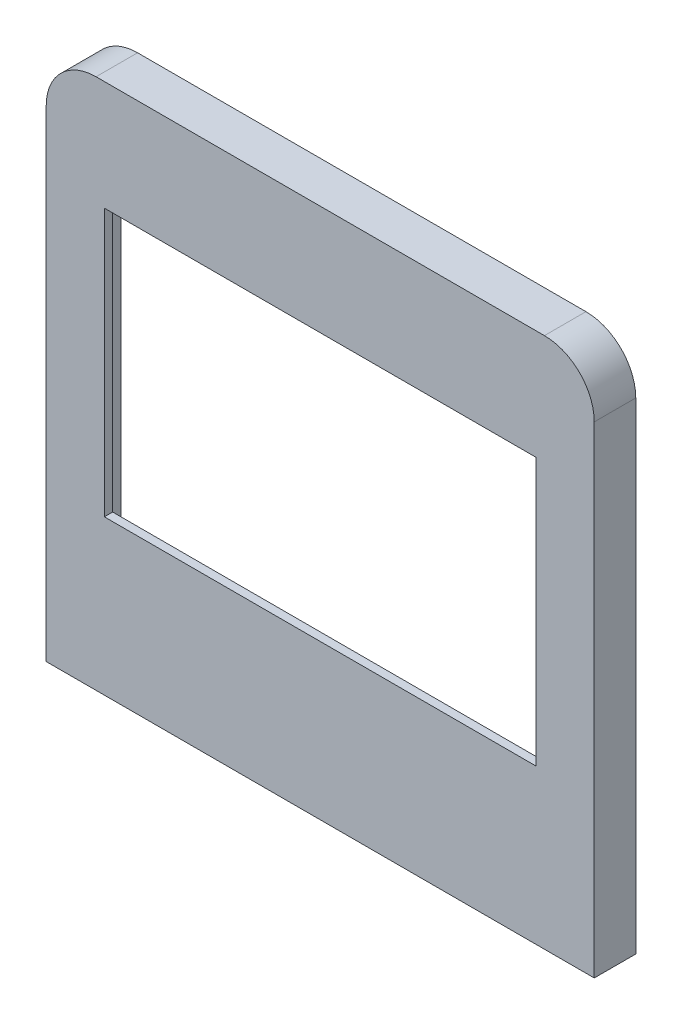
ISO-10303-21;
HEADER;
FILE_DESCRIPTION(('STEP AP214'),'2;1');
FILE_NAME('part.step','',(''),(''),'','','');
FILE_SCHEMA(('AUTOMOTIVE_DESIGN { 1 0 10303 214 1 1 1 1 }'));
ENDSEC;
DATA;
#1=APPLICATION_CONTEXT('core data for automotive mechanical design processes');
#2=APPLICATION_PROTOCOL_DEFINITION('international standard','automotive_design',2000,#1);
#3=PRODUCT_CONTEXT('',#1,'mechanical');
#4=PRODUCT('Part','Part','',(#3));
#5=PRODUCT_RELATED_PRODUCT_CATEGORY('part','',(#4));
#6=PRODUCT_DEFINITION_FORMATION('','',#4);
#7=PRODUCT_DEFINITION_CONTEXT('part definition',#1,'design');
#8=PRODUCT_DEFINITION('design','',#6,#7);
#9=PRODUCT_DEFINITION_SHAPE('','',#8);
#10=(LENGTH_UNIT() NAMED_UNIT(*) SI_UNIT(.MILLI.,.METRE.));
#11=(NAMED_UNIT(*) PLANE_ANGLE_UNIT() SI_UNIT($,.RADIAN.));
#12=(NAMED_UNIT(*) SI_UNIT($,.STERADIAN.) SOLID_ANGLE_UNIT());
#13=UNCERTAINTY_MEASURE_WITH_UNIT(LENGTH_MEASURE(1.E-05),#10,'distance_accuracy_value','');
#14=(GEOMETRIC_REPRESENTATION_CONTEXT(3) GLOBAL_UNCERTAINTY_ASSIGNED_CONTEXT((#13)) GLOBAL_UNIT_ASSIGNED_CONTEXT((#10,
#11,#12)) REPRESENTATION_CONTEXT('',''));
#15=CARTESIAN_POINT('',(0.,0.,0.));
#16=DIRECTION('',(0.,0.,1.));
#17=DIRECTION('',(1.,0.,0.));
#18=AXIS2_PLACEMENT_3D('',#15,#16,#17);
#19=CARTESIAN_POINT('',(-13.1650165016502,10.4372937293729,0.5));
#20=DIRECTION('',(0.,0.,1.));
#21=DIRECTION('',(1.,0.,0.));
#22=AXIS2_PLACEMENT_3D('',#19,#20,#21);
#23=CYLINDRICAL_SURFACE('',#22,3.);
#24=DIRECTION('',(0.,0.,1.));
#25=VECTOR('',#24,1.);
#26=CARTESIAN_POINT('',(-13.1650165016502,13.4372937293729,0.5));
#27=LINE('',#26,#25);
#28=CARTESIAN_POINT('',(-13.1650165016502,13.4372937293729,-2.));
#29=VERTEX_POINT('',#28);
#30=CARTESIAN_POINT('',(-13.1650165016502,13.4372937293729,0.5));
#31=VERTEX_POINT('',#30);
#32=EDGE_CURVE('E237',#29,#31,#27,.T.);
#33=ORIENTED_EDGE('',*,*,#32,.F.);
#34=CARTESIAN_POINT('',(-13.1650165016502,10.4372937293729,-2.));
#35=DIRECTION('',(0.,0.,-1.));
#36=DIRECTION('',(-1.,0.,0.));
#37=AXIS2_PLACEMENT_3D('',#34,#35,#36);
#38=CIRCLE('',#37,3.);
#39=CARTESIAN_POINT('',(-16.1650165016502,10.4372937293729,-2.));
#40=VERTEX_POINT('',#39);
#41=EDGE_CURVE('E40',#40,#29,#38,.T.);
#42=ORIENTED_EDGE('',*,*,#41,.F.);
#43=DIRECTION('',(0.,0.,1.));
#44=VECTOR('',#43,1.);
#45=CARTESIAN_POINT('',(-16.1650165016502,10.4372937293729,0.5));
#46=LINE('',#45,#44);
#47=CARTESIAN_POINT('',(-16.1650165016502,10.4372937293729,0.5));
#48=VERTEX_POINT('',#47);
#49=EDGE_CURVE('E240',#48,#40,#46,.F.);
#50=ORIENTED_EDGE('',*,*,#49,.F.);
#51=CARTESIAN_POINT('',(-13.1650165016502,10.4372937293729,0.5));
#52=DIRECTION('',(0.,0.,-1.));
#53=DIRECTION('',(-1.,0.,0.));
#54=AXIS2_PLACEMENT_3D('',#51,#52,#53);
#55=CIRCLE('',#54,3.);
#56=EDGE_CURVE('E11',#31,#48,#55,.F.);
#57=ORIENTED_EDGE('',*,*,#56,.F.);
#58=EDGE_LOOP('',(#33,#42,#50,#57));
#59=FACE_BOUND('',#58,.T.);
#60=ADVANCED_FACE('F33',(#59),#23,.T.);
#61=CARTESIAN_POINT('',(13.8349834983498,10.4372937293729,0.5));
#62=DIRECTION('',(0.,0.,-1.));
#63=DIRECTION('',(-1.,0.,0.));
#64=AXIS2_PLACEMENT_3D('',#61,#62,#63);
#65=CYLINDRICAL_SURFACE('',#64,3.);
#66=DIRECTION('',(0.,0.,-1.));
#67=VECTOR('',#66,1.);
#68=CARTESIAN_POINT('',(13.8349834983498,13.4372937293729,0.5));
#69=LINE('',#68,#67);
#70=CARTESIAN_POINT('',(13.8349834983498,13.4372937293729,0.5));
#71=VERTEX_POINT('',#70);
#72=CARTESIAN_POINT('',(13.8349834983498,13.4372937293729,-2.));
#73=VERTEX_POINT('',#72);
#74=EDGE_CURVE('E227',#71,#73,#69,.T.);
#75=ORIENTED_EDGE('',*,*,#74,.F.);
#76=CARTESIAN_POINT('',(13.8349834983498,10.4372937293729,0.5));
#77=DIRECTION('',(0.,0.,-1.));
#78=DIRECTION('',(-1.,0.,0.));
#79=AXIS2_PLACEMENT_3D('',#76,#77,#78);
#80=CIRCLE('',#79,3.);
#81=CARTESIAN_POINT('',(16.8349834983498,10.4372937293729,0.5));
#82=VERTEX_POINT('',#81);
#83=EDGE_CURVE('E233',#82,#71,#80,.F.);
#84=ORIENTED_EDGE('',*,*,#83,.F.);
#85=DIRECTION('',(0.,0.,-1.));
#86=VECTOR('',#85,1.);
#87=CARTESIAN_POINT('',(16.8349834983498,10.4372937293729,0.5));
#88=LINE('',#87,#86);
#89=CARTESIAN_POINT('',(16.8349834983498,10.4372937293729,-2.));
#90=VERTEX_POINT('',#89);
#91=EDGE_CURVE('E230',#90,#82,#88,.F.);
#92=ORIENTED_EDGE('',*,*,#91,.F.);
#93=CARTESIAN_POINT('',(13.8349834983498,10.4372937293729,-2.));
#94=DIRECTION('',(0.,0.,-1.));
#95=DIRECTION('',(-1.,0.,0.));
#96=AXIS2_PLACEMENT_3D('',#93,#94,#95);
#97=CIRCLE('',#96,3.);
#98=EDGE_CURVE('E235',#73,#90,#97,.T.);
#99=ORIENTED_EDGE('',*,*,#98,.F.);
#100=EDGE_LOOP('',(#75,#84,#92,#99));
#101=FACE_BOUND('',#100,.T.);
#102=ADVANCED_FACE('F250',(#101),#65,.T.);
#103=CARTESIAN_POINT('',(0.,0.,0.5));
#104=DIRECTION('',(0.,0.,-1.));
#105=DIRECTION('',(-1.,0.,0.));
#106=AXIS2_PLACEMENT_3D('',#103,#104,#105);
#107=PLANE('',#106);
#108=DIRECTION('',(-1.,0.,0.));
#109=VECTOR('',#108,1.);
#110=CARTESIAN_POINT('',(-16.1650165016502,13.4372937293729,0.5));
#111=LINE('',#110,#109);
#112=EDGE_CURVE('E213',#71,#31,#111,.T.);
#113=ORIENTED_EDGE('',*,*,#112,.T.);
#114=ORIENTED_EDGE('',*,*,#56,.T.);
#115=DIRECTION('',(0.,-1.,0.));
#116=VECTOR('',#115,1.);
#117=CARTESIAN_POINT('',(-16.1650165016502,13.4372937293729,0.5));
#118=LINE('',#117,#116);
#119=CARTESIAN_POINT('',(-16.1650165016502,-18.5627062706271,0.5));
#120=VERTEX_POINT('',#119);
#121=EDGE_CURVE('E215',#48,#120,#118,.T.);
#122=ORIENTED_EDGE('',*,*,#121,.T.);
#123=DIRECTION('',(1.,0.,0.));
#124=VECTOR('',#123,1.);
#125=CARTESIAN_POINT('',(-16.1650165016502,-18.5627062706271,0.5));
#126=LINE('',#125,#124);
#127=CARTESIAN_POINT('',(16.8349834983498,-18.5627062706271,0.5));
#128=VERTEX_POINT('',#127);
#129=EDGE_CURVE('E217',#120,#128,#126,.T.);
#130=ORIENTED_EDGE('',*,*,#129,.T.);
#131=DIRECTION('',(0.,1.,0.));
#132=VECTOR('',#131,1.);
#133=CARTESIAN_POINT('',(16.8349834983498,13.4372937293729,0.5));
#134=LINE('',#133,#132);
#135=EDGE_CURVE('E219',#128,#82,#134,.T.);
#136=ORIENTED_EDGE('',*,*,#135,.T.);
#137=ORIENTED_EDGE('',*,*,#83,.T.);
#138=EDGE_LOOP('',(#113,#114,#122,#130,#136,#137));
#139=FACE_BOUND('',#138,.T.);
#140=DIRECTION('',(0.,-1.,0.));
#141=VECTOR('',#140,1.);
#142=CARTESIAN_POINT('',(-12.6650165016502,6.83729372937294,0.5));
#143=LINE('',#142,#141);
#144=CARTESIAN_POINT('',(-12.6650165016502,6.83729372937294,0.5));
#145=VERTEX_POINT('',#144);
#146=CARTESIAN_POINT('',(-12.6650165016502,-9.26270627062707,0.5));
#147=VERTEX_POINT('',#146);
#148=EDGE_CURVE('E183',#145,#147,#143,.T.);
#149=ORIENTED_EDGE('',*,*,#148,.F.);
#150=DIRECTION('',(-1.,0.,0.));
#151=VECTOR('',#150,1.);
#152=CARTESIAN_POINT('',(-12.6650165016502,6.83729372937294,0.5));
#153=LINE('',#152,#151);
#154=CARTESIAN_POINT('',(13.3349834983498,6.83729372937294,0.5));
#155=VERTEX_POINT('',#154);
#156=EDGE_CURVE('E191',#155,#145,#153,.T.);
#157=ORIENTED_EDGE('',*,*,#156,.F.);
#158=DIRECTION('',(0.,1.,0.));
#159=VECTOR('',#158,1.);
#160=CARTESIAN_POINT('',(13.3349834983498,6.83729372937294,0.5));
#161=LINE('',#160,#159);
#162=CARTESIAN_POINT('',(13.3349834983498,-9.26270627062707,0.5));
#163=VERTEX_POINT('',#162);
#164=EDGE_CURVE('E188',#163,#155,#161,.T.);
#165=ORIENTED_EDGE('',*,*,#164,.F.);
#166=DIRECTION('',(1.,0.,0.));
#167=VECTOR('',#166,1.);
#168=CARTESIAN_POINT('',(-12.6650165016502,-9.26270627062707,0.5));
#169=LINE('',#168,#167);
#170=EDGE_CURVE('E185',#147,#163,#169,.T.);
#171=ORIENTED_EDGE('',*,*,#170,.F.);
#172=EDGE_LOOP('',(#149,#157,#165,#171));
#173=FACE_BOUND('',#172,.T.);
#174=ADVANCED_FACE('F265',(#139,#173),#107,.F.);
#175=CARTESIAN_POINT('',(0.,0.,0.));
#176=DIRECTION('',(0.,0.,-1.));
#177=DIRECTION('',(-1.,0.,0.));
#178=AXIS2_PLACEMENT_3D('',#175,#176,#177);
#179=PLANE('',#178);
#180=DIRECTION('',(1.,0.,0.));
#181=VECTOR('',#180,1.);
#182=CARTESIAN_POINT('',(14.8349834983498,11.4372937293729,0.));
#183=LINE('',#182,#181);
#184=CARTESIAN_POINT('',(-14.1650165016502,11.4372937293729,0.));
#185=VERTEX_POINT('',#184);
#186=CARTESIAN_POINT('',(14.8349834983498,11.4372937293729,0.));
#187=VERTEX_POINT('',#186);
#188=EDGE_CURVE('E162',#185,#187,#183,.T.);
#189=ORIENTED_EDGE('',*,*,#188,.T.);
#190=DIRECTION('',(0.,-1.,0.));
#191=VECTOR('',#190,1.);
#192=CARTESIAN_POINT('',(14.8349834983498,11.4372937293729,0.));
#193=LINE('',#192,#191);
#194=CARTESIAN_POINT('',(14.8349834983498,-16.5627062706271,0.));
#195=VERTEX_POINT('',#194);
#196=EDGE_CURVE('E149',#187,#195,#193,.T.);
#197=ORIENTED_EDGE('',*,*,#196,.T.);
#198=DIRECTION('',(-1.,0.,0.));
#199=VECTOR('',#198,1.);
#200=CARTESIAN_POINT('',(14.8349834983498,-16.5627062706271,0.));
#201=LINE('',#200,#199);
#202=CARTESIAN_POINT('',(-14.1650165016502,-16.5627062706271,0.));
#203=VERTEX_POINT('',#202);
#204=EDGE_CURVE('E165',#195,#203,#201,.T.);
#205=ORIENTED_EDGE('',*,*,#204,.T.);
#206=DIRECTION('',(0.,1.,0.));
#207=VECTOR('',#206,1.);
#208=CARTESIAN_POINT('',(-14.1650165016502,11.4372937293729,0.));
#209=LINE('',#208,#207);
#210=EDGE_CURVE('E142',#203,#185,#209,.T.);
#211=ORIENTED_EDGE('',*,*,#210,.T.);
#212=EDGE_LOOP('',(#189,#197,#205,#211));
#213=FACE_BOUND('',#212,.T.);
#214=DIRECTION('',(-1.,0.,0.));
#215=VECTOR('',#214,1.);
#216=CARTESIAN_POINT('',(-12.6650165016502,6.83729372937294,0.));
#217=LINE('',#216,#215);
#218=CARTESIAN_POINT('',(13.3349834983498,6.83729372937294,0.));
#219=VERTEX_POINT('',#218);
#220=CARTESIAN_POINT('',(-12.6650165016502,6.83729372937294,0.));
#221=VERTEX_POINT('',#220);
#222=EDGE_CURVE('E186',#219,#221,#217,.T.);
#223=ORIENTED_EDGE('',*,*,#222,.T.);
#224=DIRECTION('',(0.,-1.,0.));
#225=VECTOR('',#224,1.);
#226=CARTESIAN_POINT('',(-12.6650165016502,6.83729372937294,0.));
#227=LINE('',#226,#225);
#228=CARTESIAN_POINT('',(-12.6650165016502,-9.26270627062707,0.));
#229=VERTEX_POINT('',#228);
#230=EDGE_CURVE('E182',#221,#229,#227,.T.);
#231=ORIENTED_EDGE('',*,*,#230,.T.);
#232=DIRECTION('',(1.,0.,0.));
#233=VECTOR('',#232,1.);
#234=CARTESIAN_POINT('',(-12.6650165016502,-9.26270627062707,0.));
#235=LINE('',#234,#233);
#236=CARTESIAN_POINT('',(13.3349834983498,-9.26270627062707,0.));
#237=VERTEX_POINT('',#236);
#238=EDGE_CURVE('E196',#229,#237,#235,.T.);
#239=ORIENTED_EDGE('',*,*,#238,.T.);
#240=DIRECTION('',(0.,1.,0.));
#241=VECTOR('',#240,1.);
#242=CARTESIAN_POINT('',(13.3349834983498,6.83729372937294,0.));
#243=LINE('',#242,#241);
#244=EDGE_CURVE('E199',#237,#219,#243,.T.);
#245=ORIENTED_EDGE('',*,*,#244,.T.);
#246=EDGE_LOOP('',(#223,#231,#239,#245));
#247=FACE_BOUND('',#246,.T.);
#248=ADVANCED_FACE('F268',(#213,#247),#179,.T.);
#249=CARTESIAN_POINT('',(-16.1650165016502,13.4372937293729,0.5));
#250=DIRECTION('',(0.,-1.,0.));
#251=DIRECTION('',(0.,0.,-1.));
#252=AXIS2_PLACEMENT_3D('',#249,#250,#251);
#253=PLANE('',#252);
#254=DIRECTION('',(1.,0.,0.));
#255=VECTOR('',#254,1.);
#256=CARTESIAN_POINT('',(16.8349834983498,13.4372937293729,-2.));
#257=LINE('',#256,#255);
#258=EDGE_CURVE('E180',#29,#73,#257,.T.);
#259=ORIENTED_EDGE('',*,*,#258,.F.);
#260=ORIENTED_EDGE('',*,*,#32,.T.);
#261=ORIENTED_EDGE('',*,*,#112,.F.);
#262=ORIENTED_EDGE('',*,*,#74,.T.);
#263=EDGE_LOOP('',(#259,#260,#261,#262));
#264=FACE_BOUND('',#263,.T.);
#265=ADVANCED_FACE('F247',(#264),#253,.F.);
#266=CARTESIAN_POINT('',(-16.1650165016502,13.4372937293729,0.5));
#267=DIRECTION('',(1.,0.,0.));
#268=DIRECTION('',(0.,0.,-1.));
#269=AXIS2_PLACEMENT_3D('',#266,#267,#268);
#270=PLANE('',#269);
#271=ORIENTED_EDGE('',*,*,#121,.F.);
#272=ORIENTED_EDGE('',*,*,#49,.T.);
#273=DIRECTION('',(0.,1.,0.));
#274=VECTOR('',#273,1.);
#275=CARTESIAN_POINT('',(-16.1650165016502,13.4372937293729,-2.));
#276=LINE('',#275,#274);
#277=CARTESIAN_POINT('',(-16.1650165016502,-18.5627062706271,-2.));
#278=VERTEX_POINT('',#277);
#279=EDGE_CURVE('E177',#278,#40,#276,.T.);
#280=ORIENTED_EDGE('',*,*,#279,.F.);
#281=DIRECTION('',(0.,0.,-1.));
#282=VECTOR('',#281,1.);
#283=CARTESIAN_POINT('',(-16.1650165016502,-18.5627062706271,0.5));
#284=LINE('',#283,#282);
#285=EDGE_CURVE('E225',#120,#278,#284,.T.);
#286=ORIENTED_EDGE('',*,*,#285,.F.);
#287=EDGE_LOOP('',(#271,#272,#280,#286));
#288=FACE_BOUND('',#287,.T.);
#289=ADVANCED_FACE('F264',(#288),#270,.F.);
#290=CARTESIAN_POINT('',(-16.1650165016502,-18.5627062706271,0.5));
#291=DIRECTION('',(0.,1.,0.));
#292=DIRECTION('',(0.,0.,1.));
#293=AXIS2_PLACEMENT_3D('',#290,#291,#292);
#294=PLANE('',#293);
#295=ORIENTED_EDGE('',*,*,#285,.T.);
#296=DIRECTION('',(-1.,0.,0.));
#297=VECTOR('',#296,1.);
#298=CARTESIAN_POINT('',(16.8349834983498,-18.5627062706271,-2.));
#299=LINE('',#298,#297);
#300=CARTESIAN_POINT('',(16.8349834983498,-18.5627062706271,-2.));
#301=VERTEX_POINT('',#300);
#302=EDGE_CURVE('E174',#301,#278,#299,.T.);
#303=ORIENTED_EDGE('',*,*,#302,.F.);
#304=DIRECTION('',(0.,0.,-1.));
#305=VECTOR('',#304,1.);
#306=CARTESIAN_POINT('',(16.8349834983498,-18.5627062706271,0.5));
#307=LINE('',#306,#305);
#308=EDGE_CURVE('E222',#128,#301,#307,.T.);
#309=ORIENTED_EDGE('',*,*,#308,.F.);
#310=ORIENTED_EDGE('',*,*,#129,.F.);
#311=EDGE_LOOP('',(#295,#303,#309,#310));
#312=FACE_BOUND('',#311,.T.);
#313=ADVANCED_FACE('F260',(#312),#294,.F.);
#314=CARTESIAN_POINT('',(16.8349834983498,13.4372937293729,0.5));
#315=DIRECTION('',(-1.,0.,0.));
#316=DIRECTION('',(0.,0.,1.));
#317=AXIS2_PLACEMENT_3D('',#314,#315,#316);
#318=PLANE('',#317);
#319=DIRECTION('',(0.,-1.,0.));
#320=VECTOR('',#319,1.);
#321=CARTESIAN_POINT('',(16.8349834983498,13.4372937293729,-2.));
#322=LINE('',#321,#320);
#323=EDGE_CURVE('E150',#90,#301,#322,.T.);
#324=ORIENTED_EDGE('',*,*,#323,.F.);
#325=ORIENTED_EDGE('',*,*,#91,.T.);
#326=ORIENTED_EDGE('',*,*,#135,.F.);
#327=ORIENTED_EDGE('',*,*,#308,.T.);
#328=EDGE_LOOP('',(#324,#325,#326,#327));
#329=FACE_BOUND('',#328,.T.);
#330=ADVANCED_FACE('F257',(#329),#318,.F.);
#331=CARTESIAN_POINT('',(-12.6650165016502,6.83729372937294,0.5));
#332=DIRECTION('',(1.,0.,0.));
#333=DIRECTION('',(0.,1.,0.));
#334=AXIS2_PLACEMENT_3D('',#331,#332,#333);
#335=PLANE('',#334);
#336=ORIENTED_EDGE('',*,*,#230,.F.);
#337=DIRECTION('',(0.,0.,-1.));
#338=VECTOR('',#337,1.);
#339=CARTESIAN_POINT('',(-12.6650165016502,6.83729372937294,0.5));
#340=LINE('',#339,#338);
#341=EDGE_CURVE('E193',#145,#221,#340,.T.);
#342=ORIENTED_EDGE('',*,*,#341,.F.);
#343=ORIENTED_EDGE('',*,*,#148,.T.);
#344=DIRECTION('',(0.,0.,-1.));
#345=VECTOR('',#344,1.);
#346=CARTESIAN_POINT('',(-12.6650165016502,-9.26270627062707,0.5));
#347=LINE('',#346,#345);
#348=EDGE_CURVE('E210',#147,#229,#347,.T.);
#349=ORIENTED_EDGE('',*,*,#348,.T.);
#350=EDGE_LOOP('',(#336,#342,#343,#349));
#351=FACE_BOUND('',#350,.T.);
#352=ADVANCED_FACE('F277',(#351),#335,.T.);
#353=CARTESIAN_POINT('',(-12.6650165016502,-9.26270627062707,0.5));
#354=DIRECTION('',(0.,1.,0.));
#355=DIRECTION('',(0.,0.,1.));
#356=AXIS2_PLACEMENT_3D('',#353,#354,#355);
#357=PLANE('',#356);
#358=ORIENTED_EDGE('',*,*,#238,.F.);
#359=ORIENTED_EDGE('',*,*,#348,.F.);
#360=ORIENTED_EDGE('',*,*,#170,.T.);
#361=DIRECTION('',(0.,0.,-1.));
#362=VECTOR('',#361,1.);
#363=CARTESIAN_POINT('',(13.3349834983498,-9.26270627062707,0.5));
#364=LINE('',#363,#362);
#365=EDGE_CURVE('E208',#163,#237,#364,.T.);
#366=ORIENTED_EDGE('',*,*,#365,.T.);
#367=EDGE_LOOP('',(#358,#359,#360,#366));
#368=FACE_BOUND('',#367,.T.);
#369=ADVANCED_FACE('F279',(#368),#357,.T.);
#370=CARTESIAN_POINT('',(13.3349834983498,6.83729372937294,0.5));
#371=DIRECTION('',(-1.,0.,0.));
#372=DIRECTION('',(0.,-1.,0.));
#373=AXIS2_PLACEMENT_3D('',#370,#371,#372);
#374=PLANE('',#373);
#375=ORIENTED_EDGE('',*,*,#244,.F.);
#376=ORIENTED_EDGE('',*,*,#365,.F.);
#377=ORIENTED_EDGE('',*,*,#164,.T.);
#378=DIRECTION('',(0.,0.,-1.));
#379=VECTOR('',#378,1.);
#380=CARTESIAN_POINT('',(13.3349834983498,6.83729372937294,0.5));
#381=LINE('',#380,#379);
#382=EDGE_CURVE('E206',#155,#219,#381,.T.);
#383=ORIENTED_EDGE('',*,*,#382,.T.);
#384=EDGE_LOOP('',(#375,#376,#377,#383));
#385=FACE_BOUND('',#384,.T.);
#386=ADVANCED_FACE('F287',(#385),#374,.T.);
#387=CARTESIAN_POINT('',(-12.6650165016502,6.83729372937294,0.5));
#388=DIRECTION('',(0.,-1.,0.));
#389=DIRECTION('',(0.,0.,-1.));
#390=AXIS2_PLACEMENT_3D('',#387,#388,#389);
#391=PLANE('',#390);
#392=ORIENTED_EDGE('',*,*,#222,.F.);
#393=ORIENTED_EDGE('',*,*,#382,.F.);
#394=ORIENTED_EDGE('',*,*,#156,.T.);
#395=ORIENTED_EDGE('',*,*,#341,.T.);
#396=EDGE_LOOP('',(#392,#393,#394,#395));
#397=FACE_BOUND('',#396,.T.);
#398=ADVANCED_FACE('F285',(#397),#391,.T.);
#399=CARTESIAN_POINT('',(0.,0.,-2.));
#400=DIRECTION('',(0.,0.,-1.));
#401=DIRECTION('',(-1.,0.,0.));
#402=AXIS2_PLACEMENT_3D('',#399,#400,#401);
#403=PLANE('',#402);
#404=ORIENTED_EDGE('',*,*,#279,.T.);
#405=ORIENTED_EDGE('',*,*,#41,.T.);
#406=ORIENTED_EDGE('',*,*,#258,.T.);
#407=ORIENTED_EDGE('',*,*,#98,.T.);
#408=ORIENTED_EDGE('',*,*,#323,.T.);
#409=ORIENTED_EDGE('',*,*,#302,.T.);
#410=EDGE_LOOP('',(#404,#405,#406,#407,#408,#409));
#411=FACE_BOUND('',#410,.T.);
#412=DIRECTION('',(0.,-1.,0.));
#413=VECTOR('',#412,1.);
#414=CARTESIAN_POINT('',(14.8349834983498,11.4372937293729,-2.));
#415=LINE('',#414,#413);
#416=CARTESIAN_POINT('',(14.8349834983498,11.4372937293729,-2.));
#417=VERTEX_POINT('',#416);
#418=CARTESIAN_POINT('',(14.8349834983498,-16.5627062706271,-2.));
#419=VERTEX_POINT('',#418);
#420=EDGE_CURVE('E141',#417,#419,#415,.T.);
#421=ORIENTED_EDGE('',*,*,#420,.F.);
#422=DIRECTION('',(1.,0.,0.));
#423=VECTOR('',#422,1.);
#424=CARTESIAN_POINT('',(14.8349834983498,11.4372937293729,-2.));
#425=LINE('',#424,#423);
#426=CARTESIAN_POINT('',(-14.1650165016502,11.4372937293729,-2.));
#427=VERTEX_POINT('',#426);
#428=EDGE_CURVE('E131',#427,#417,#425,.T.);
#429=ORIENTED_EDGE('',*,*,#428,.F.);
#430=DIRECTION('',(0.,1.,0.));
#431=VECTOR('',#430,1.);
#432=CARTESIAN_POINT('',(-14.1650165016502,11.4372937293729,-2.));
#433=LINE('',#432,#431);
#434=CARTESIAN_POINT('',(-14.1650165016502,-16.5627062706271,-2.));
#435=VERTEX_POINT('',#434);
#436=EDGE_CURVE('E158',#435,#427,#433,.T.);
#437=ORIENTED_EDGE('',*,*,#436,.F.);
#438=DIRECTION('',(-1.,0.,0.));
#439=VECTOR('',#438,1.);
#440=CARTESIAN_POINT('',(14.8349834983498,-16.5627062706271,-2.));
#441=LINE('',#440,#439);
#442=EDGE_CURVE('E156',#419,#435,#441,.T.);
#443=ORIENTED_EDGE('',*,*,#442,.F.);
#444=EDGE_LOOP('',(#421,#429,#437,#443));
#445=FACE_BOUND('',#444,.T.);
#446=ADVANCED_FACE('F154',(#411,#445),#403,.T.);
#447=CARTESIAN_POINT('',(14.8349834983498,11.4372937293729,-2.));
#448=DIRECTION('',(0.,-1.,0.));
#449=DIRECTION('',(0.,0.,-1.));
#450=AXIS2_PLACEMENT_3D('',#447,#448,#449);
#451=PLANE('',#450);
#452=ORIENTED_EDGE('',*,*,#188,.F.);
#453=DIRECTION('',(0.,0.,1.));
#454=VECTOR('',#453,1.);
#455=CARTESIAN_POINT('',(-14.1650165016502,11.4372937293729,-2.));
#456=LINE('',#455,#454);
#457=EDGE_CURVE('E137',#427,#185,#456,.T.);
#458=ORIENTED_EDGE('',*,*,#457,.F.);
#459=ORIENTED_EDGE('',*,*,#428,.T.);
#460=DIRECTION('',(0.,0.,1.));
#461=VECTOR('',#460,1.);
#462=CARTESIAN_POINT('',(14.8349834983498,11.4372937293729,-2.));
#463=LINE('',#462,#461);
#464=EDGE_CURVE('E135',#417,#187,#463,.T.);
#465=ORIENTED_EDGE('',*,*,#464,.T.);
#466=EDGE_LOOP('',(#452,#458,#459,#465));
#467=FACE_BOUND('',#466,.T.);
#468=ADVANCED_FACE('F134',(#467),#451,.T.);
#469=CARTESIAN_POINT('',(14.8349834983498,11.4372937293729,-2.));
#470=DIRECTION('',(-1.,0.,0.));
#471=DIRECTION('',(0.,0.,1.));
#472=AXIS2_PLACEMENT_3D('',#469,#470,#471);
#473=PLANE('',#472);
#474=ORIENTED_EDGE('',*,*,#196,.F.);
#475=ORIENTED_EDGE('',*,*,#464,.F.);
#476=ORIENTED_EDGE('',*,*,#420,.T.);
#477=DIRECTION('',(0.,0.,1.));
#478=VECTOR('',#477,1.);
#479=CARTESIAN_POINT('',(14.8349834983498,-16.5627062706271,-2.));
#480=LINE('',#479,#478);
#481=EDGE_CURVE('E151',#419,#195,#480,.T.);
#482=ORIENTED_EDGE('',*,*,#481,.T.);
#483=EDGE_LOOP('',(#474,#475,#476,#482));
#484=FACE_BOUND('',#483,.T.);
#485=ADVANCED_FACE('F146',(#484),#473,.T.);
#486=CARTESIAN_POINT('',(14.8349834983498,-16.5627062706271,-2.));
#487=DIRECTION('',(0.,1.,0.));
#488=DIRECTION('',(0.,0.,1.));
#489=AXIS2_PLACEMENT_3D('',#486,#487,#488);
#490=PLANE('',#489);
#491=ORIENTED_EDGE('',*,*,#204,.F.);
#492=ORIENTED_EDGE('',*,*,#481,.F.);
#493=ORIENTED_EDGE('',*,*,#442,.T.);
#494=DIRECTION('',(0.,0.,1.));
#495=VECTOR('',#494,1.);
#496=CARTESIAN_POINT('',(-14.1650165016502,-16.5627062706271,-2.));
#497=LINE('',#496,#495);
#498=EDGE_CURVE('E169',#435,#203,#497,.T.);
#499=ORIENTED_EDGE('',*,*,#498,.T.);
#500=EDGE_LOOP('',(#491,#492,#493,#499));
#501=FACE_BOUND('',#500,.T.);
#502=ADVANCED_FACE('F370',(#501),#490,.T.);
#503=CARTESIAN_POINT('',(-14.1650165016502,11.4372937293729,-2.));
#504=DIRECTION('',(1.,0.,0.));
#505=DIRECTION('',(0.,1.,0.));
#506=AXIS2_PLACEMENT_3D('',#503,#504,#505);
#507=PLANE('',#506);
#508=ORIENTED_EDGE('',*,*,#210,.F.);
#509=ORIENTED_EDGE('',*,*,#498,.F.);
#510=ORIENTED_EDGE('',*,*,#436,.T.);
#511=ORIENTED_EDGE('',*,*,#457,.T.);
#512=EDGE_LOOP('',(#508,#509,#510,#511));
#513=FACE_BOUND('',#512,.T.);
#514=ADVANCED_FACE('F379',(#513),#507,.T.);
#515=CLOSED_SHELL('',(#60,#102,#174,#248,#265,#289,#313,#330,#352,#369,#386,#398,#446,#468,#485,
#502,#514));
#516=MANIFOLD_SOLID_BREP('B2',#515);
#517=ADVANCED_BREP_SHAPE_REPRESENTATION('',(#18,#516),#14);
#518=SHAPE_DEFINITION_REPRESENTATION(#9,#517);
ENDSEC;
END-ISO-10303-21;
